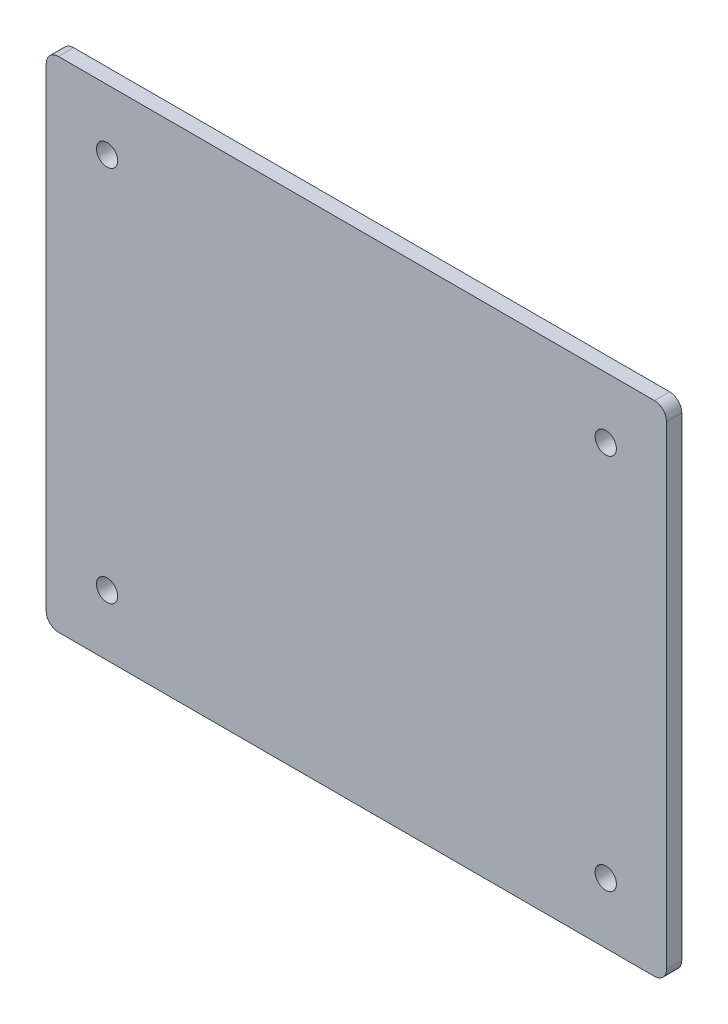
ISO-10303-21;
HEADER;
FILE_DESCRIPTION(('STEP AP214'),'2;1');
FILE_NAME('part.step','',(''),(''),'','','');
FILE_SCHEMA(('AUTOMOTIVE_DESIGN { 1 0 10303 214 1 1 1 1 }'));
ENDSEC;
DATA;
#1=APPLICATION_CONTEXT('core data for automotive mechanical design processes');
#2=APPLICATION_PROTOCOL_DEFINITION('international standard','automotive_design',2000,#1);
#3=PRODUCT_CONTEXT('',#1,'mechanical');
#4=PRODUCT('Part','Part','',(#3));
#5=PRODUCT_RELATED_PRODUCT_CATEGORY('part','',(#4));
#6=PRODUCT_DEFINITION_FORMATION('','',#4);
#7=PRODUCT_DEFINITION_CONTEXT('part definition',#1,'design');
#8=PRODUCT_DEFINITION('design','',#6,#7);
#9=PRODUCT_DEFINITION_SHAPE('','',#8);
#10=(LENGTH_UNIT() NAMED_UNIT(*) SI_UNIT(.MILLI.,.METRE.));
#11=(NAMED_UNIT(*) PLANE_ANGLE_UNIT() SI_UNIT($,.RADIAN.));
#12=(NAMED_UNIT(*) SI_UNIT($,.STERADIAN.) SOLID_ANGLE_UNIT());
#13=UNCERTAINTY_MEASURE_WITH_UNIT(LENGTH_MEASURE(1.E-05),#10,'distance_accuracy_value','');
#14=(GEOMETRIC_REPRESENTATION_CONTEXT(3) GLOBAL_UNCERTAINTY_ASSIGNED_CONTEXT((#13)) GLOBAL_UNIT_ASSIGNED_CONTEXT((#10,
#11,#12)) REPRESENTATION_CONTEXT('',''));
#15=CARTESIAN_POINT('',(0.,0.,0.));
#16=DIRECTION('',(0.,0.,1.));
#17=DIRECTION('',(1.,0.,0.));
#18=AXIS2_PLACEMENT_3D('',#15,#16,#17);
#19=CARTESIAN_POINT('',(0.,0.,2.5));
#20=DIRECTION('',(0.,0.,1.));
#21=DIRECTION('',(1.,0.,0.));
#22=AXIS2_PLACEMENT_3D('',#19,#20,#21);
#23=PLANE('',#22);
#24=CARTESIAN_POINT('',(40.9999999999999,-31.,2.5));
#25=DIRECTION('',(0.,0.,1.));
#26=DIRECTION('',(1.,0.,0.));
#27=AXIS2_PLACEMENT_3D('',#24,#25,#26);
#28=CIRCLE('',#27,1.75);
#29=CARTESIAN_POINT('',(42.7499999999999,-31.,2.5));
#30=VERTEX_POINT('',#29);
#31=EDGE_CURVE('E176',#30,#30,#28,.T.);
#32=ORIENTED_EDGE('',*,*,#31,.F.);
#33=EDGE_LOOP('',(#32));
#34=FACE_BOUND('',#33,.T.);
#35=CARTESIAN_POINT('',(-41.,31.,2.5));
#36=DIRECTION('',(0.,0.,1.));
#37=DIRECTION('',(1.,0.,0.));
#38=AXIS2_PLACEMENT_3D('',#35,#36,#37);
#39=CIRCLE('',#38,1.75);
#40=CARTESIAN_POINT('',(-39.25,31.,2.5));
#41=VERTEX_POINT('',#40);
#42=EDGE_CURVE('E122',#41,#41,#39,.T.);
#43=ORIENTED_EDGE('',*,*,#42,.F.);
#44=EDGE_LOOP('',(#43));
#45=FACE_BOUND('',#44,.T.);
#46=CARTESIAN_POINT('',(41.,31.,2.5));
#47=DIRECTION('',(0.,0.,1.));
#48=DIRECTION('',(-1.,0.,0.));
#49=AXIS2_PLACEMENT_3D('',#46,#47,#48);
#50=CIRCLE('',#49,1.75);
#51=CARTESIAN_POINT('',(39.25,31.,2.5));
#52=VERTEX_POINT('',#51);
#53=EDGE_CURVE('E182',#52,#52,#50,.T.);
#54=ORIENTED_EDGE('',*,*,#53,.F.);
#55=EDGE_LOOP('',(#54));
#56=FACE_BOUND('',#55,.T.);
#57=CARTESIAN_POINT('',(-41.,-31.,2.5));
#58=DIRECTION('',(0.,0.,1.));
#59=DIRECTION('',(-1.,0.,0.));
#60=AXIS2_PLACEMENT_3D('',#57,#58,#59);
#61=CIRCLE('',#60,1.75);
#62=CARTESIAN_POINT('',(-42.75,-31.,2.5));
#63=VERTEX_POINT('',#62);
#64=EDGE_CURVE('E170',#63,#63,#61,.T.);
#65=ORIENTED_EDGE('',*,*,#64,.F.);
#66=EDGE_LOOP('',(#65));
#67=FACE_BOUND('',#66,.T.);
#68=DIRECTION('',(1.,0.,0.));
#69=VECTOR('',#68,1.);
#70=CARTESIAN_POINT('',(-51.,-41.,2.5));
#71=LINE('',#70,#69);
#72=CARTESIAN_POINT('',(-49.,-41.,2.5));
#73=VERTEX_POINT('',#72);
#74=CARTESIAN_POINT('',(49.,-41.,2.5));
#75=VERTEX_POINT('',#74);
#76=EDGE_CURVE('E101',#73,#75,#71,.T.);
#77=ORIENTED_EDGE('',*,*,#76,.T.);
#78=CARTESIAN_POINT('',(49.,-39.,2.5));
#79=DIRECTION('',(0.,0.,1.));
#80=DIRECTION('',(1.,0.,0.));
#81=AXIS2_PLACEMENT_3D('',#78,#79,#80);
#82=CIRCLE('',#81,2.);
#83=CARTESIAN_POINT('',(51.,-39.,2.5));
#84=VERTEX_POINT('',#83);
#85=EDGE_CURVE('E133',#75,#84,#82,.T.);
#86=ORIENTED_EDGE('',*,*,#85,.T.);
#87=DIRECTION('',(0.,1.,0.));
#88=VECTOR('',#87,1.);
#89=CARTESIAN_POINT('',(51.,41.,2.5));
#90=LINE('',#89,#88);
#91=CARTESIAN_POINT('',(51.,39.,2.5));
#92=VERTEX_POINT('',#91);
#93=EDGE_CURVE('E118',#84,#92,#90,.T.);
#94=ORIENTED_EDGE('',*,*,#93,.T.);
#95=CARTESIAN_POINT('',(49.,39.,2.5));
#96=DIRECTION('',(0.,0.,1.));
#97=DIRECTION('',(1.,0.,0.));
#98=AXIS2_PLACEMENT_3D('',#95,#96,#97);
#99=CIRCLE('',#98,2.);
#100=CARTESIAN_POINT('',(49.,41.,2.5));
#101=VERTEX_POINT('',#100);
#102=EDGE_CURVE('E131',#92,#101,#99,.T.);
#103=ORIENTED_EDGE('',*,*,#102,.T.);
#104=DIRECTION('',(-1.,0.,0.));
#105=VECTOR('',#104,1.);
#106=CARTESIAN_POINT('',(-51.,41.,2.5));
#107=LINE('',#106,#105);
#108=CARTESIAN_POINT('',(-49.,41.,2.5));
#109=VERTEX_POINT('',#108);
#110=EDGE_CURVE('E155',#101,#109,#107,.T.);
#111=ORIENTED_EDGE('',*,*,#110,.T.);
#112=CARTESIAN_POINT('',(-49.,39.,2.5));
#113=DIRECTION('',(0.,0.,1.));
#114=DIRECTION('',(1.,0.,0.));
#115=AXIS2_PLACEMENT_3D('',#112,#113,#114);
#116=CIRCLE('',#115,2.);
#117=CARTESIAN_POINT('',(-51.,39.,2.5));
#118=VERTEX_POINT('',#117);
#119=EDGE_CURVE('E108',#109,#118,#116,.T.);
#120=ORIENTED_EDGE('',*,*,#119,.T.);
#121=DIRECTION('',(0.,-1.,0.));
#122=VECTOR('',#121,1.);
#123=CARTESIAN_POINT('',(-51.,41.,2.5));
#124=LINE('',#123,#122);
#125=CARTESIAN_POINT('',(-51.,-39.,2.5));
#126=VERTEX_POINT('',#125);
#127=EDGE_CURVE('E103',#118,#126,#124,.T.);
#128=ORIENTED_EDGE('',*,*,#127,.T.);
#129=CARTESIAN_POINT('',(-49.,-39.,2.5));
#130=DIRECTION('',(0.,0.,1.));
#131=DIRECTION('',(1.,0.,0.));
#132=AXIS2_PLACEMENT_3D('',#129,#130,#131);
#133=CIRCLE('',#132,2.);
#134=EDGE_CURVE('E99',#126,#73,#133,.T.);
#135=ORIENTED_EDGE('',*,*,#134,.T.);
#136=EDGE_LOOP('',(#77,#86,#94,#103,#111,#120,#128,#135));
#137=FACE_BOUND('',#136,.T.);
#138=ADVANCED_FACE('F33',(#34,#45,#56,#67,#137),#23,.T.);
#139=CARTESIAN_POINT('',(0.,0.,0.));
#140=DIRECTION('',(0.,0.,1.));
#141=DIRECTION('',(1.,0.,0.));
#142=AXIS2_PLACEMENT_3D('',#139,#140,#141);
#143=PLANE('',#142);
#144=CARTESIAN_POINT('',(-41.,31.,0.));
#145=DIRECTION('',(0.,0.,1.));
#146=DIRECTION('',(1.,0.,0.));
#147=AXIS2_PLACEMENT_3D('',#144,#145,#146);
#148=CIRCLE('',#147,1.75);
#149=CARTESIAN_POINT('',(-39.25,31.,0.));
#150=VERTEX_POINT('',#149);
#151=EDGE_CURVE('E126',#150,#150,#148,.T.);
#152=ORIENTED_EDGE('',*,*,#151,.T.);
#153=EDGE_LOOP('',(#152));
#154=FACE_BOUND('',#153,.T.);
#155=CARTESIAN_POINT('',(41.,31.,0.));
#156=DIRECTION('',(0.,0.,1.));
#157=DIRECTION('',(-1.,0.,0.));
#158=AXIS2_PLACEMENT_3D('',#155,#156,#157);
#159=CIRCLE('',#158,1.75);
#160=CARTESIAN_POINT('',(39.25,31.,0.));
#161=VERTEX_POINT('',#160);
#162=EDGE_CURVE('E179',#161,#161,#159,.T.);
#163=ORIENTED_EDGE('',*,*,#162,.T.);
#164=EDGE_LOOP('',(#163));
#165=FACE_BOUND('',#164,.T.);
#166=CARTESIAN_POINT('',(40.9999999999999,-31.,0.));
#167=DIRECTION('',(0.,0.,1.));
#168=DIRECTION('',(1.,0.,0.));
#169=AXIS2_PLACEMENT_3D('',#166,#167,#168);
#170=CIRCLE('',#169,1.75);
#171=CARTESIAN_POINT('',(42.7499999999999,-31.,0.));
#172=VERTEX_POINT('',#171);
#173=EDGE_CURVE('E173',#172,#172,#170,.T.);
#174=ORIENTED_EDGE('',*,*,#173,.T.);
#175=EDGE_LOOP('',(#174));
#176=FACE_BOUND('',#175,.T.);
#177=CARTESIAN_POINT('',(-41.,-31.,0.));
#178=DIRECTION('',(0.,0.,1.));
#179=DIRECTION('',(-1.,0.,0.));
#180=AXIS2_PLACEMENT_3D('',#177,#178,#179);
#181=CIRCLE('',#180,1.75);
#182=CARTESIAN_POINT('',(-42.75,-31.,0.));
#183=VERTEX_POINT('',#182);
#184=EDGE_CURVE('E166',#183,#183,#181,.T.);
#185=ORIENTED_EDGE('',*,*,#184,.T.);
#186=EDGE_LOOP('',(#185));
#187=FACE_BOUND('',#186,.T.);
#188=DIRECTION('',(0.,1.,0.));
#189=VECTOR('',#188,1.);
#190=CARTESIAN_POINT('',(51.,41.,0.));
#191=LINE('',#190,#189);
#192=CARTESIAN_POINT('',(51.,-39.,0.));
#193=VERTEX_POINT('',#192);
#194=CARTESIAN_POINT('',(51.,39.,0.));
#195=VERTEX_POINT('',#194);
#196=EDGE_CURVE('E157',#193,#195,#191,.T.);
#197=ORIENTED_EDGE('',*,*,#196,.F.);
#198=CARTESIAN_POINT('',(49.,-39.,0.));
#199=DIRECTION('',(0.,0.,1.));
#200=DIRECTION('',(1.,0.,0.));
#201=AXIS2_PLACEMENT_3D('',#198,#199,#200);
#202=CIRCLE('',#201,2.);
#203=CARTESIAN_POINT('',(49.,-41.,0.));
#204=VERTEX_POINT('',#203);
#205=EDGE_CURVE('E144',#193,#204,#202,.F.);
#206=ORIENTED_EDGE('',*,*,#205,.T.);
#207=DIRECTION('',(1.,0.,0.));
#208=VECTOR('',#207,1.);
#209=CARTESIAN_POINT('',(-51.,-41.,0.));
#210=LINE('',#209,#208);
#211=CARTESIAN_POINT('',(-49.,-41.,0.));
#212=VERTEX_POINT('',#211);
#213=EDGE_CURVE('E154',#212,#204,#210,.T.);
#214=ORIENTED_EDGE('',*,*,#213,.F.);
#215=CARTESIAN_POINT('',(-49.,-39.,0.));
#216=DIRECTION('',(0.,0.,1.));
#217=DIRECTION('',(1.,0.,0.));
#218=AXIS2_PLACEMENT_3D('',#215,#216,#217);
#219=CIRCLE('',#218,2.);
#220=CARTESIAN_POINT('',(-51.,-39.,0.));
#221=VERTEX_POINT('',#220);
#222=EDGE_CURVE('E121',#212,#221,#219,.F.);
#223=ORIENTED_EDGE('',*,*,#222,.T.);
#224=DIRECTION('',(0.,-1.,0.));
#225=VECTOR('',#224,1.);
#226=CARTESIAN_POINT('',(-51.,41.,0.));
#227=LINE('',#226,#225);
#228=CARTESIAN_POINT('',(-51.,39.,0.));
#229=VERTEX_POINT('',#228);
#230=EDGE_CURVE('E153',#229,#221,#227,.T.);
#231=ORIENTED_EDGE('',*,*,#230,.F.);
#232=CARTESIAN_POINT('',(-49.,39.,0.));
#233=DIRECTION('',(0.,0.,1.));
#234=DIRECTION('',(1.,0.,0.));
#235=AXIS2_PLACEMENT_3D('',#232,#233,#234);
#236=CIRCLE('',#235,2.);
#237=CARTESIAN_POINT('',(-49.,41.,0.));
#238=VERTEX_POINT('',#237);
#239=EDGE_CURVE('E48',#229,#238,#236,.F.);
#240=ORIENTED_EDGE('',*,*,#239,.T.);
#241=DIRECTION('',(-1.,0.,0.));
#242=VECTOR('',#241,1.);
#243=CARTESIAN_POINT('',(-51.,41.,0.));
#244=LINE('',#243,#242);
#245=CARTESIAN_POINT('',(49.,41.,0.));
#246=VERTEX_POINT('',#245);
#247=EDGE_CURVE('E164',#246,#238,#244,.T.);
#248=ORIENTED_EDGE('',*,*,#247,.F.);
#249=CARTESIAN_POINT('',(49.,39.,0.));
#250=DIRECTION('',(0.,0.,1.));
#251=DIRECTION('',(1.,0.,0.));
#252=AXIS2_PLACEMENT_3D('',#249,#250,#251);
#253=CIRCLE('',#252,2.);
#254=EDGE_CURVE('E142',#246,#195,#253,.F.);
#255=ORIENTED_EDGE('',*,*,#254,.T.);
#256=EDGE_LOOP('',(#197,#206,#214,#223,#231,#240,#248,#255));
#257=FACE_BOUND('',#256,.T.);
#258=ADVANCED_FACE('F188',(#154,#165,#176,#187,#257),#143,.F.);
#259=CARTESIAN_POINT('',(-41.,31.,2.5));
#260=DIRECTION('',(0.,0.,-1.));
#261=DIRECTION('',(-1.,0.,0.));
#262=AXIS2_PLACEMENT_3D('',#259,#260,#261);
#263=CYLINDRICAL_SURFACE('',#262,1.75);
#264=ORIENTED_EDGE('',*,*,#42,.T.);
#265=EDGE_LOOP('',(#264));
#266=FACE_BOUND('',#265,.T.);
#267=ORIENTED_EDGE('',*,*,#151,.F.);
#268=EDGE_LOOP('',(#267));
#269=FACE_BOUND('',#268,.T.);
#270=ADVANCED_FACE('F194',(#266,#269),#263,.F.);
#271=CARTESIAN_POINT('',(41.,31.,2.5));
#272=DIRECTION('',(0.,0.,-1.));
#273=DIRECTION('',(-1.,0.,0.));
#274=AXIS2_PLACEMENT_3D('',#271,#272,#273);
#275=CYLINDRICAL_SURFACE('',#274,1.75);
#276=ORIENTED_EDGE('',*,*,#53,.T.);
#277=EDGE_LOOP('',(#276));
#278=FACE_BOUND('',#277,.T.);
#279=ORIENTED_EDGE('',*,*,#162,.F.);
#280=EDGE_LOOP('',(#279));
#281=FACE_BOUND('',#280,.T.);
#282=ADVANCED_FACE('F191',(#278,#281),#275,.F.);
#283=CARTESIAN_POINT('',(40.9999999999999,-31.,2.5));
#284=DIRECTION('',(0.,0.,-1.));
#285=DIRECTION('',(-1.,0.,0.));
#286=AXIS2_PLACEMENT_3D('',#283,#284,#285);
#287=CYLINDRICAL_SURFACE('',#286,1.75);
#288=ORIENTED_EDGE('',*,*,#31,.T.);
#289=EDGE_LOOP('',(#288));
#290=FACE_BOUND('',#289,.T.);
#291=ORIENTED_EDGE('',*,*,#173,.F.);
#292=EDGE_LOOP('',(#291));
#293=FACE_BOUND('',#292,.T.);
#294=ADVANCED_FACE('F193',(#290,#293),#287,.F.);
#295=CARTESIAN_POINT('',(-41.,-31.,2.5));
#296=DIRECTION('',(0.,0.,-1.));
#297=DIRECTION('',(-1.,0.,0.));
#298=AXIS2_PLACEMENT_3D('',#295,#296,#297);
#299=CYLINDRICAL_SURFACE('',#298,1.75);
#300=ORIENTED_EDGE('',*,*,#64,.T.);
#301=EDGE_LOOP('',(#300));
#302=FACE_BOUND('',#301,.T.);
#303=ORIENTED_EDGE('',*,*,#184,.F.);
#304=EDGE_LOOP('',(#303));
#305=FACE_BOUND('',#304,.T.);
#306=ADVANCED_FACE('F201',(#302,#305),#299,.F.);
#307=CARTESIAN_POINT('',(-51.,41.,0.));
#308=DIRECTION('',(-1.,0.,0.));
#309=DIRECTION('',(0.,-1.,0.));
#310=AXIS2_PLACEMENT_3D('',#307,#308,#309);
#311=PLANE('',#310);
#312=ORIENTED_EDGE('',*,*,#127,.F.);
#313=DIRECTION('',(0.,0.,1.));
#314=VECTOR('',#313,1.);
#315=CARTESIAN_POINT('',(-51.,39.,0.));
#316=LINE('',#315,#314);
#317=EDGE_CURVE('E11',#118,#229,#316,.F.);
#318=ORIENTED_EDGE('',*,*,#317,.T.);
#319=ORIENTED_EDGE('',*,*,#230,.T.);
#320=DIRECTION('',(0.,0.,1.));
#321=VECTOR('',#320,1.);
#322=CARTESIAN_POINT('',(-51.,-39.,0.));
#323=LINE('',#322,#321);
#324=EDGE_CURVE('E41',#221,#126,#323,.T.);
#325=ORIENTED_EDGE('',*,*,#324,.T.);
#326=EDGE_LOOP('',(#312,#318,#319,#325));
#327=FACE_BOUND('',#326,.T.);
#328=ADVANCED_FACE('F151',(#327),#311,.T.);
#329=CARTESIAN_POINT('',(-51.,41.,0.));
#330=DIRECTION('',(0.,1.,0.));
#331=DIRECTION('',(0.,0.,1.));
#332=AXIS2_PLACEMENT_3D('',#329,#330,#331);
#333=PLANE('',#332);
#334=ORIENTED_EDGE('',*,*,#110,.F.);
#335=DIRECTION('',(0.,0.,1.));
#336=VECTOR('',#335,1.);
#337=CARTESIAN_POINT('',(49.,41.,0.));
#338=LINE('',#337,#336);
#339=EDGE_CURVE('E55',#101,#246,#338,.F.);
#340=ORIENTED_EDGE('',*,*,#339,.T.);
#341=ORIENTED_EDGE('',*,*,#247,.T.);
#342=DIRECTION('',(0.,0.,1.));
#343=VECTOR('',#342,1.);
#344=CARTESIAN_POINT('',(-49.,41.,0.));
#345=LINE('',#344,#343);
#346=EDGE_CURVE('E146',#238,#109,#345,.T.);
#347=ORIENTED_EDGE('',*,*,#346,.T.);
#348=EDGE_LOOP('',(#334,#340,#341,#347));
#349=FACE_BOUND('',#348,.T.);
#350=ADVANCED_FACE('F231',(#349),#333,.T.);
#351=CARTESIAN_POINT('',(51.,41.,0.));
#352=DIRECTION('',(1.,0.,0.));
#353=DIRECTION('',(0.,1.,0.));
#354=AXIS2_PLACEMENT_3D('',#351,#352,#353);
#355=PLANE('',#354);
#356=ORIENTED_EDGE('',*,*,#93,.F.);
#357=DIRECTION('',(0.,0.,1.));
#358=VECTOR('',#357,1.);
#359=CARTESIAN_POINT('',(51.,-39.,0.));
#360=LINE('',#359,#358);
#361=EDGE_CURVE('E138',#84,#193,#360,.F.);
#362=ORIENTED_EDGE('',*,*,#361,.T.);
#363=ORIENTED_EDGE('',*,*,#196,.T.);
#364=DIRECTION('',(0.,0.,1.));
#365=VECTOR('',#364,1.);
#366=CARTESIAN_POINT('',(51.,39.,0.));
#367=LINE('',#366,#365);
#368=EDGE_CURVE('E135',#195,#92,#367,.T.);
#369=ORIENTED_EDGE('',*,*,#368,.T.);
#370=EDGE_LOOP('',(#356,#362,#363,#369));
#371=FACE_BOUND('',#370,.T.);
#372=ADVANCED_FACE('F236',(#371),#355,.T.);
#373=CARTESIAN_POINT('',(-51.,-41.,0.));
#374=DIRECTION('',(0.,-1.,0.));
#375=DIRECTION('',(0.,0.,-1.));
#376=AXIS2_PLACEMENT_3D('',#373,#374,#375);
#377=PLANE('',#376);
#378=ORIENTED_EDGE('',*,*,#213,.T.);
#379=DIRECTION('',(0.,0.,1.));
#380=VECTOR('',#379,1.);
#381=CARTESIAN_POINT('',(49.,-41.,0.));
#382=LINE('',#381,#380);
#383=EDGE_CURVE('E109',#204,#75,#382,.T.);
#384=ORIENTED_EDGE('',*,*,#383,.T.);
#385=ORIENTED_EDGE('',*,*,#76,.F.);
#386=DIRECTION('',(0.,0.,1.));
#387=VECTOR('',#386,1.);
#388=CARTESIAN_POINT('',(-49.,-41.,0.));
#389=LINE('',#388,#387);
#390=EDGE_CURVE('E115',#73,#212,#389,.F.);
#391=ORIENTED_EDGE('',*,*,#390,.T.);
#392=EDGE_LOOP('',(#378,#384,#385,#391));
#393=FACE_BOUND('',#392,.T.);
#394=ADVANCED_FACE('F114',(#393),#377,.T.);
#395=CARTESIAN_POINT('',(49.,-39.,0.));
#396=DIRECTION('',(0.,0.,1.));
#397=DIRECTION('',(1.,0.,0.));
#398=AXIS2_PLACEMENT_3D('',#395,#396,#397);
#399=CYLINDRICAL_SURFACE('',#398,2.);
#400=ORIENTED_EDGE('',*,*,#205,.F.);
#401=ORIENTED_EDGE('',*,*,#361,.F.);
#402=ORIENTED_EDGE('',*,*,#85,.F.);
#403=ORIENTED_EDGE('',*,*,#383,.F.);
#404=EDGE_LOOP('',(#400,#401,#402,#403));
#405=FACE_BOUND('',#404,.T.);
#406=ADVANCED_FACE('F217',(#405),#399,.T.);
#407=CARTESIAN_POINT('',(49.,39.,0.));
#408=DIRECTION('',(0.,0.,1.));
#409=DIRECTION('',(1.,0.,0.));
#410=AXIS2_PLACEMENT_3D('',#407,#408,#409);
#411=CYLINDRICAL_SURFACE('',#410,2.);
#412=ORIENTED_EDGE('',*,*,#254,.F.);
#413=ORIENTED_EDGE('',*,*,#339,.F.);
#414=ORIENTED_EDGE('',*,*,#102,.F.);
#415=ORIENTED_EDGE('',*,*,#368,.F.);
#416=EDGE_LOOP('',(#412,#413,#414,#415));
#417=FACE_BOUND('',#416,.T.);
#418=ADVANCED_FACE('F220',(#417),#411,.T.);
#419=CARTESIAN_POINT('',(-49.,39.,0.));
#420=DIRECTION('',(0.,0.,1.));
#421=DIRECTION('',(1.,0.,0.));
#422=AXIS2_PLACEMENT_3D('',#419,#420,#421);
#423=CYLINDRICAL_SURFACE('',#422,2.);
#424=ORIENTED_EDGE('',*,*,#239,.F.);
#425=ORIENTED_EDGE('',*,*,#317,.F.);
#426=ORIENTED_EDGE('',*,*,#119,.F.);
#427=ORIENTED_EDGE('',*,*,#346,.F.);
#428=EDGE_LOOP('',(#424,#425,#426,#427));
#429=FACE_BOUND('',#428,.T.);
#430=ADVANCED_FACE('F223',(#429),#423,.T.);
#431=CARTESIAN_POINT('',(-49.,-39.,0.));
#432=DIRECTION('',(0.,0.,1.));
#433=DIRECTION('',(1.,0.,0.));
#434=AXIS2_PLACEMENT_3D('',#431,#432,#433);
#435=CYLINDRICAL_SURFACE('',#434,2.);
#436=ORIENTED_EDGE('',*,*,#222,.F.);
#437=ORIENTED_EDGE('',*,*,#390,.F.);
#438=ORIENTED_EDGE('',*,*,#134,.F.);
#439=ORIENTED_EDGE('',*,*,#324,.F.);
#440=EDGE_LOOP('',(#436,#437,#438,#439));
#441=FACE_BOUND('',#440,.T.);
#442=ADVANCED_FACE('F35',(#441),#435,.T.);
#443=CLOSED_SHELL('',(#138,#258,#270,#282,#294,#306,#328,#350,#372,#394,#406,#418,#430,#442));
#444=MANIFOLD_SOLID_BREP('B2',#443);
#445=ADVANCED_BREP_SHAPE_REPRESENTATION('',(#18,#444),#14);
#446=SHAPE_DEFINITION_REPRESENTATION(#9,#445);
ENDSEC;
END-ISO-10303-21;
